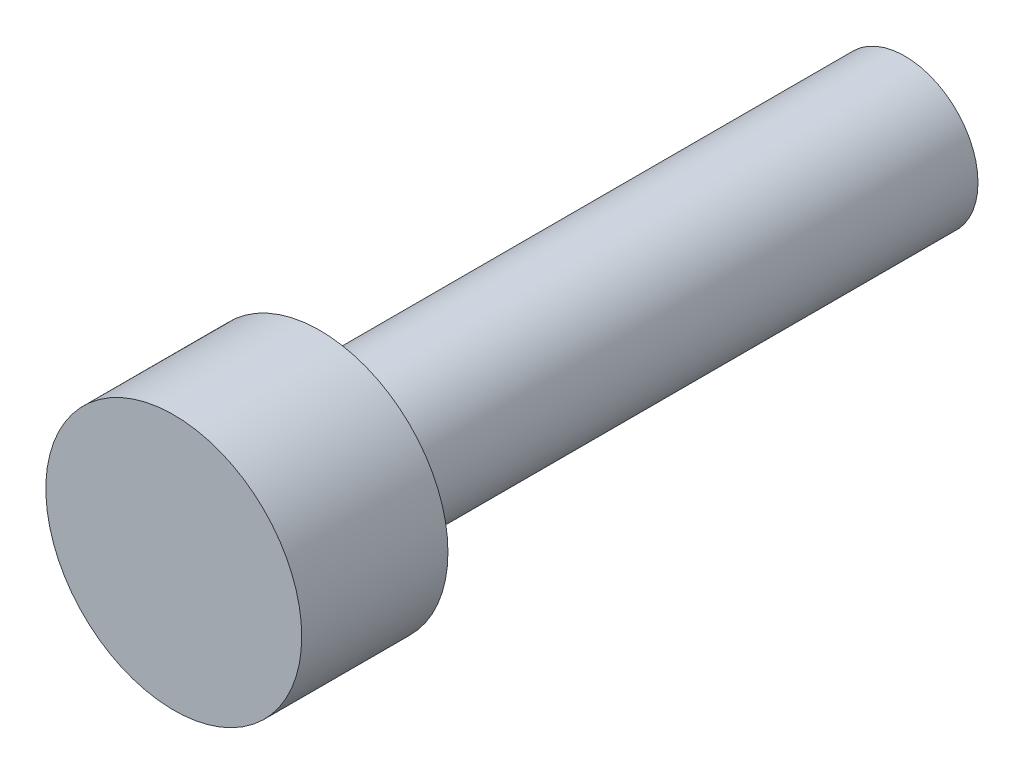
ISO-10303-21;
HEADER;
FILE_DESCRIPTION(('STEP AP214'),'2;1');
FILE_NAME('part.step','',(''),(''),'','','');
FILE_SCHEMA(('AUTOMOTIVE_DESIGN { 1 0 10303 214 1 1 1 1 }'));
ENDSEC;
DATA;
#1=APPLICATION_CONTEXT('core data for automotive mechanical design processes');
#2=APPLICATION_PROTOCOL_DEFINITION('international standard','automotive_design',2000,#1);
#3=PRODUCT_CONTEXT('',#1,'mechanical');
#4=PRODUCT('Part','Part','',(#3));
#5=PRODUCT_RELATED_PRODUCT_CATEGORY('part','',(#4));
#6=PRODUCT_DEFINITION_FORMATION('','',#4);
#7=PRODUCT_DEFINITION_CONTEXT('part definition',#1,'design');
#8=PRODUCT_DEFINITION('design','',#6,#7);
#9=PRODUCT_DEFINITION_SHAPE('','',#8);
#10=(LENGTH_UNIT() NAMED_UNIT(*) SI_UNIT(.MILLI.,.METRE.));
#11=(NAMED_UNIT(*) PLANE_ANGLE_UNIT() SI_UNIT($,.RADIAN.));
#12=(NAMED_UNIT(*) SI_UNIT($,.STERADIAN.) SOLID_ANGLE_UNIT());
#13=UNCERTAINTY_MEASURE_WITH_UNIT(LENGTH_MEASURE(1.E-05),#10,'distance_accuracy_value','');
#14=(GEOMETRIC_REPRESENTATION_CONTEXT(3) GLOBAL_UNCERTAINTY_ASSIGNED_CONTEXT((#13)) GLOBAL_UNIT_ASSIGNED_CONTEXT((#10,
#11,#12)) REPRESENTATION_CONTEXT('',''));
#15=CARTESIAN_POINT('',(0.,0.,0.));
#16=DIRECTION('',(0.,0.,1.));
#17=DIRECTION('',(1.,0.,0.));
#18=AXIS2_PLACEMENT_3D('',#15,#16,#17);
#19=CARTESIAN_POINT('',(0.,0.,0.));
#20=DIRECTION('',(0.,0.,-1.));
#21=DIRECTION('',(-1.,0.,0.));
#22=AXIS2_PLACEMENT_3D('',#19,#20,#21);
#23=CYLINDRICAL_SURFACE('',#22,2.);
#24=CARTESIAN_POINT('',(0.,0.,0.));
#25=DIRECTION('',(0.,0.,1.));
#26=DIRECTION('',(1.,0.,0.));
#27=AXIS2_PLACEMENT_3D('',#24,#25,#26);
#28=CIRCLE('',#27,2.);
#29=CARTESIAN_POINT('',(2.,0.,0.));
#30=VERTEX_POINT('',#29);
#31=EDGE_CURVE('E10',#30,#30,#28,.T.);
#32=ORIENTED_EDGE('',*,*,#31,.F.);
#33=EDGE_LOOP('',(#32));
#34=FACE_BOUND('',#33,.T.);
#35=CARTESIAN_POINT('',(0.,0.,-16.));
#36=DIRECTION('',(0.,0.,1.));
#37=DIRECTION('',(1.,0.,0.));
#38=AXIS2_PLACEMENT_3D('',#35,#36,#37);
#39=CIRCLE('',#38,2.);
#40=CARTESIAN_POINT('',(2.,0.,-16.));
#41=VERTEX_POINT('',#40);
#42=EDGE_CURVE('E44',#41,#41,#39,.T.);
#43=ORIENTED_EDGE('',*,*,#42,.T.);
#44=EDGE_LOOP('',(#43));
#45=FACE_BOUND('',#44,.T.);
#46=ADVANCED_FACE('F41',(#34,#45),#23,.T.);
#47=CARTESIAN_POINT('',(0.,0.,-16.));
#48=DIRECTION('',(0.,0.,1.));
#49=DIRECTION('',(1.,0.,0.));
#50=AXIS2_PLACEMENT_3D('',#47,#48,#49);
#51=PLANE('',#50);
#52=ORIENTED_EDGE('',*,*,#42,.F.);
#53=EDGE_LOOP('',(#52));
#54=FACE_BOUND('',#53,.T.);
#55=ADVANCED_FACE('F64',(#54),#51,.F.);
#56=CARTESIAN_POINT('',(0.,0.,4.));
#57=DIRECTION('',(0.,0.,-1.));
#58=DIRECTION('',(-1.,0.,0.));
#59=AXIS2_PLACEMENT_3D('',#56,#57,#58);
#60=CYLINDRICAL_SURFACE('',#59,3.5);
#61=CARTESIAN_POINT('',(0.,0.,4.));
#62=DIRECTION('',(0.,0.,1.));
#63=DIRECTION('',(1.,0.,0.));
#64=AXIS2_PLACEMENT_3D('',#61,#62,#63);
#65=CIRCLE('',#64,3.5);
#66=CARTESIAN_POINT('',(3.5,0.,4.));
#67=VERTEX_POINT('',#66);
#68=EDGE_CURVE('E51',#67,#67,#65,.T.);
#69=ORIENTED_EDGE('',*,*,#68,.F.);
#70=EDGE_LOOP('',(#69));
#71=FACE_BOUND('',#70,.T.);
#72=CARTESIAN_POINT('',(0.,0.,0.));
#73=DIRECTION('',(0.,0.,1.));
#74=DIRECTION('',(1.,0.,0.));
#75=AXIS2_PLACEMENT_3D('',#72,#73,#74);
#76=CIRCLE('',#75,3.5);
#77=CARTESIAN_POINT('',(3.5,0.,0.));
#78=VERTEX_POINT('',#77);
#79=EDGE_CURVE('E53',#78,#78,#76,.T.);
#80=ORIENTED_EDGE('',*,*,#79,.T.);
#81=EDGE_LOOP('',(#80));
#82=FACE_BOUND('',#81,.T.);
#83=ADVANCED_FACE('F61',(#71,#82),#60,.T.);
#84=CARTESIAN_POINT('',(0.,0.,4.));
#85=DIRECTION('',(0.,0.,1.));
#86=DIRECTION('',(1.,0.,0.));
#87=AXIS2_PLACEMENT_3D('',#84,#85,#86);
#88=PLANE('',#87);
#89=ORIENTED_EDGE('',*,*,#68,.T.);
#90=EDGE_LOOP('',(#89));
#91=FACE_BOUND('',#90,.T.);
#92=ADVANCED_FACE('F59',(#91),#88,.T.);
#93=CARTESIAN_POINT('',(0.,0.,0.));
#94=DIRECTION('',(0.,0.,1.));
#95=DIRECTION('',(1.,0.,0.));
#96=AXIS2_PLACEMENT_3D('',#93,#94,#95);
#97=PLANE('',#96);
#98=ORIENTED_EDGE('',*,*,#31,.T.);
#99=EDGE_LOOP('',(#98));
#100=FACE_BOUND('',#99,.T.);
#101=ORIENTED_EDGE('',*,*,#79,.F.);
#102=EDGE_LOOP('',(#101));
#103=FACE_BOUND('',#102,.T.);
#104=ADVANCED_FACE('F68',(#100,#103),#97,.F.);
#105=CLOSED_SHELL('',(#46,#55,#83,#92,#104));
#106=MANIFOLD_SOLID_BREP('B2',#105);
#107=ADVANCED_BREP_SHAPE_REPRESENTATION('',(#18,#106),#14);
#108=SHAPE_DEFINITION_REPRESENTATION(#9,#107);
ENDSEC;
END-ISO-10303-21;
